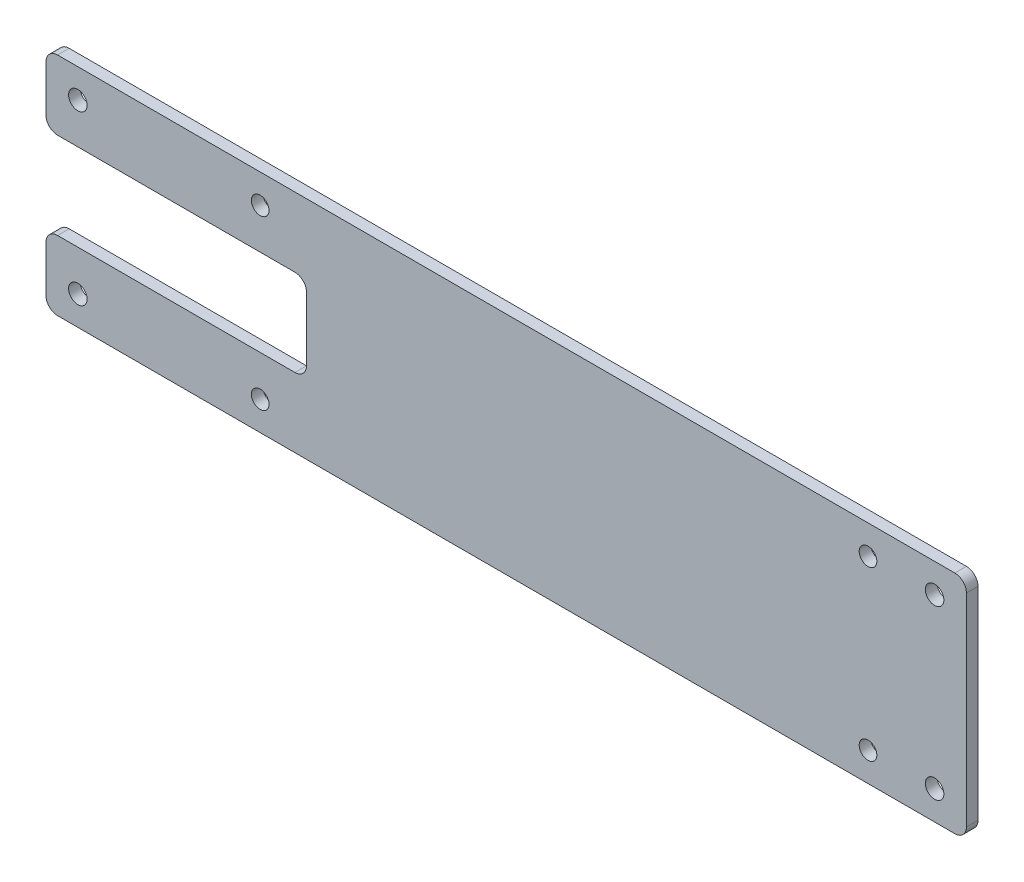
ISO-10303-21;
HEADER;
FILE_DESCRIPTION(('STEP AP214'),'2;1');
FILE_NAME('part.step','',(''),(''),'','','');
FILE_SCHEMA(('AUTOMOTIVE_DESIGN { 1 0 10303 214 1 1 1 1 }'));
ENDSEC;
DATA;
#1=APPLICATION_CONTEXT('core data for automotive mechanical design processes');
#2=APPLICATION_PROTOCOL_DEFINITION('international standard','automotive_design',2000,#1);
#3=PRODUCT_CONTEXT('',#1,'mechanical');
#4=PRODUCT('Part','Part','',(#3));
#5=PRODUCT_RELATED_PRODUCT_CATEGORY('part','',(#4));
#6=PRODUCT_DEFINITION_FORMATION('','',#4);
#7=PRODUCT_DEFINITION_CONTEXT('part definition',#1,'design');
#8=PRODUCT_DEFINITION('design','',#6,#7);
#9=PRODUCT_DEFINITION_SHAPE('','',#8);
#10=(LENGTH_UNIT() NAMED_UNIT(*) SI_UNIT(.MILLI.,.METRE.));
#11=(NAMED_UNIT(*) PLANE_ANGLE_UNIT() SI_UNIT($,.RADIAN.));
#12=(NAMED_UNIT(*) SI_UNIT($,.STERADIAN.) SOLID_ANGLE_UNIT());
#13=UNCERTAINTY_MEASURE_WITH_UNIT(LENGTH_MEASURE(1.E-05),#10,'distance_accuracy_value','');
#14=(GEOMETRIC_REPRESENTATION_CONTEXT(3) GLOBAL_UNCERTAINTY_ASSIGNED_CONTEXT((#13)) GLOBAL_UNIT_ASSIGNED_CONTEXT((#10,
#11,#12)) REPRESENTATION_CONTEXT('',''));
#15=CARTESIAN_POINT('',(0.,0.,0.));
#16=DIRECTION('',(0.,0.,1.));
#17=DIRECTION('',(1.,0.,0.));
#18=AXIS2_PLACEMENT_3D('',#15,#16,#17);
#19=CARTESIAN_POINT('',(-89.5,0.,2.));
#20=DIRECTION('',(-1.,0.,0.));
#21=DIRECTION('',(0.,0.,1.));
#22=AXIS2_PLACEMENT_3D('',#19,#20,#21);
#23=PLANE('',#22);
#24=DIRECTION('',(0.,1.,0.));
#25=VECTOR('',#24,1.);
#26=CARTESIAN_POINT('',(-89.5,0.,2.));
#27=LINE('',#26,#25);
#28=CARTESIAN_POINT('',(-89.5,-17.5,2.));
#29=VERTEX_POINT('',#28);
#30=CARTESIAN_POINT('',(-89.5,-9.5,2.));
#31=VERTEX_POINT('',#30);
#32=EDGE_CURVE('E305',#29,#31,#27,.T.);
#33=ORIENTED_EDGE('',*,*,#32,.T.);
#34=DIRECTION('',(0.,0.,1.));
#35=VECTOR('',#34,1.);
#36=CARTESIAN_POINT('',(-89.5,-9.5,2.));
#37=LINE('',#36,#35);
#38=CARTESIAN_POINT('',(-89.5,-9.5,0.));
#39=VERTEX_POINT('',#38);
#40=EDGE_CURVE('E219',#31,#39,#37,.F.);
#41=ORIENTED_EDGE('',*,*,#40,.T.);
#42=DIRECTION('',(0.,1.,0.));
#43=VECTOR('',#42,1.);
#44=CARTESIAN_POINT('',(-89.5,0.,0.));
#45=LINE('',#44,#43);
#46=CARTESIAN_POINT('',(-89.5,-17.5,0.));
#47=VERTEX_POINT('',#46);
#48=EDGE_CURVE('E268',#47,#39,#45,.T.);
#49=ORIENTED_EDGE('',*,*,#48,.F.);
#50=DIRECTION('',(0.,0.,-1.));
#51=VECTOR('',#50,1.);
#52=CARTESIAN_POINT('',(-89.5,-17.5,2.));
#53=LINE('',#52,#51);
#54=EDGE_CURVE('E221',#47,#29,#53,.F.);
#55=ORIENTED_EDGE('',*,*,#54,.T.);
#56=EDGE_LOOP('',(#33,#41,#49,#55));
#57=FACE_BOUND('',#56,.T.);
#58=ADVANCED_FACE('F38',(#57),#23,.T.);
#59=CARTESIAN_POINT('',(0.,0.,2.));
#60=DIRECTION('',(0.,0.,1.));
#61=DIRECTION('',(1.,0.,0.));
#62=AXIS2_PLACEMENT_3D('',#59,#60,#61);
#63=PLANE('',#62);
#64=CARTESIAN_POINT('',(-84.,-14.5,2.));
#65=DIRECTION('',(0.,0.,1.));
#66=DIRECTION('',(1.,0.,0.));
#67=AXIS2_PLACEMENT_3D('',#64,#65,#66);
#68=CIRCLE('',#67,1.6);
#69=CARTESIAN_POINT('',(-82.4,-14.5,2.));
#70=VERTEX_POINT('',#69);
#71=EDGE_CURVE('E244',#70,#70,#68,.T.);
#72=ORIENTED_EDGE('',*,*,#71,.F.);
#73=EDGE_LOOP('',(#72));
#74=FACE_BOUND('',#73,.T.);
#75=CARTESIAN_POINT('',(-84.,14.5,2.));
#76=DIRECTION('',(0.,0.,1.));
#77=DIRECTION('',(1.,0.,0.));
#78=AXIS2_PLACEMENT_3D('',#75,#76,#77);
#79=CIRCLE('',#78,1.6);
#80=CARTESIAN_POINT('',(-82.4,14.5,2.));
#81=VERTEX_POINT('',#80);
#82=EDGE_CURVE('E309',#81,#81,#79,.T.);
#83=ORIENTED_EDGE('',*,*,#82,.F.);
#84=EDGE_LOOP('',(#83));
#85=FACE_BOUND('',#84,.T.);
#86=CARTESIAN_POINT('',(52.5,14.5,2.));
#87=DIRECTION('',(0.,0.,1.));
#88=DIRECTION('',(1.,0.,0.));
#89=AXIS2_PLACEMENT_3D('',#86,#87,#88);
#90=CIRCLE('',#89,1.525);
#91=CARTESIAN_POINT('',(54.025,14.5,2.));
#92=VERTEX_POINT('',#91);
#93=EDGE_CURVE('E293',#92,#92,#90,.T.);
#94=ORIENTED_EDGE('',*,*,#93,.F.);
#95=EDGE_LOOP('',(#94));
#96=FACE_BOUND('',#95,.T.);
#97=CARTESIAN_POINT('',(52.5,-14.5,2.));
#98=DIRECTION('',(0.,0.,1.));
#99=DIRECTION('',(1.,0.,0.));
#100=AXIS2_PLACEMENT_3D('',#97,#98,#99);
#101=CIRCLE('',#100,1.525);
#102=CARTESIAN_POINT('',(54.025,-14.5,2.));
#103=VERTEX_POINT('',#102);
#104=EDGE_CURVE('E290',#103,#103,#101,.T.);
#105=ORIENTED_EDGE('',*,*,#104,.F.);
#106=EDGE_LOOP('',(#105));
#107=FACE_BOUND('',#106,.T.);
#108=CARTESIAN_POINT('',(-52.5,-14.5,2.));
#109=DIRECTION('',(0.,0.,1.));
#110=DIRECTION('',(1.,0.,0.));
#111=AXIS2_PLACEMENT_3D('',#108,#109,#110);
#112=CIRCLE('',#111,1.525);
#113=CARTESIAN_POINT('',(-50.975,-14.5,2.));
#114=VERTEX_POINT('',#113);
#115=EDGE_CURVE('E287',#114,#114,#112,.T.);
#116=ORIENTED_EDGE('',*,*,#115,.F.);
#117=EDGE_LOOP('',(#116));
#118=FACE_BOUND('',#117,.T.);
#119=CARTESIAN_POINT('',(-52.5,14.5,2.));
#120=DIRECTION('',(0.,0.,1.));
#121=DIRECTION('',(1.,0.,0.));
#122=AXIS2_PLACEMENT_3D('',#119,#120,#121);
#123=CIRCLE('',#122,1.525);
#124=CARTESIAN_POINT('',(-50.975,14.5,2.));
#125=VERTEX_POINT('',#124);
#126=EDGE_CURVE('E284',#125,#125,#123,.T.);
#127=ORIENTED_EDGE('',*,*,#126,.F.);
#128=EDGE_LOOP('',(#127));
#129=FACE_BOUND('',#128,.T.);
#130=CARTESIAN_POINT('',(64.,-14.5,2.));
#131=DIRECTION('',(0.,0.,1.));
#132=DIRECTION('',(1.,0.,0.));
#133=AXIS2_PLACEMENT_3D('',#130,#131,#132);
#134=CIRCLE('',#133,1.6);
#135=CARTESIAN_POINT('',(65.6,-14.5,2.));
#136=VERTEX_POINT('',#135);
#137=EDGE_CURVE('E281',#136,#136,#134,.T.);
#138=ORIENTED_EDGE('',*,*,#137,.F.);
#139=EDGE_LOOP('',(#138));
#140=FACE_BOUND('',#139,.T.);
#141=CARTESIAN_POINT('',(64.,14.5,2.));
#142=DIRECTION('',(0.,0.,1.));
#143=DIRECTION('',(1.,0.,0.));
#144=AXIS2_PLACEMENT_3D('',#141,#142,#143);
#145=CIRCLE('',#144,1.6);
#146=CARTESIAN_POINT('',(65.6,14.5,2.));
#147=VERTEX_POINT('',#146);
#148=EDGE_CURVE('E240',#147,#147,#145,.T.);
#149=ORIENTED_EDGE('',*,*,#148,.F.);
#150=EDGE_LOOP('',(#149));
#151=FACE_BOUND('',#150,.T.);
#152=DIRECTION('',(-1.,0.,0.));
#153=VECTOR('',#152,1.);
#154=CARTESIAN_POINT('',(0.,-7.49999999999999,2.));
#155=LINE('',#154,#153);
#156=CARTESIAN_POINT('',(-46.5,-7.5,2.));
#157=VERTEX_POINT('',#156);
#158=CARTESIAN_POINT('',(-87.5,-7.5,2.));
#159=VERTEX_POINT('',#158);
#160=EDGE_CURVE('E160',#157,#159,#155,.T.);
#161=ORIENTED_EDGE('',*,*,#160,.T.);
#162=CARTESIAN_POINT('',(-87.5,-9.5,2.));
#163=DIRECTION('',(0.,0.,1.));
#164=DIRECTION('',(1.,0.,0.));
#165=AXIS2_PLACEMENT_3D('',#162,#163,#164);
#166=CIRCLE('',#165,2.);
#167=EDGE_CURVE('E223',#159,#31,#166,.T.);
#168=ORIENTED_EDGE('',*,*,#167,.T.);
#169=ORIENTED_EDGE('',*,*,#32,.F.);
#170=CARTESIAN_POINT('',(-87.5,-17.5,2.));
#171=DIRECTION('',(0.,0.,1.));
#172=DIRECTION('',(1.,0.,0.));
#173=AXIS2_PLACEMENT_3D('',#170,#171,#172);
#174=CIRCLE('',#173,2.);
#175=CARTESIAN_POINT('',(-87.5,-19.5,2.));
#176=VERTEX_POINT('',#175);
#177=EDGE_CURVE('E225',#29,#176,#174,.T.);
#178=ORIENTED_EDGE('',*,*,#177,.T.);
#179=DIRECTION('',(-1.,0.,0.));
#180=VECTOR('',#179,1.);
#181=CARTESIAN_POINT('',(0.,-19.5,2.));
#182=LINE('',#181,#180);
#183=CARTESIAN_POINT('',(67.5,-19.5,2.));
#184=VERTEX_POINT('',#183);
#185=EDGE_CURVE('E302',#184,#176,#182,.T.);
#186=ORIENTED_EDGE('',*,*,#185,.F.);
#187=CARTESIAN_POINT('',(67.5,-17.5,2.));
#188=DIRECTION('',(0.,0.,1.));
#189=DIRECTION('',(1.,0.,0.));
#190=AXIS2_PLACEMENT_3D('',#187,#188,#189);
#191=CIRCLE('',#190,2.);
#192=CARTESIAN_POINT('',(69.5,-17.5,2.));
#193=VERTEX_POINT('',#192);
#194=EDGE_CURVE('E227',#184,#193,#191,.T.);
#195=ORIENTED_EDGE('',*,*,#194,.T.);
#196=DIRECTION('',(0.,1.,0.));
#197=VECTOR('',#196,1.);
#198=CARTESIAN_POINT('',(69.5,0.,2.));
#199=LINE('',#198,#197);
#200=CARTESIAN_POINT('',(69.5,17.5,2.));
#201=VERTEX_POINT('',#200);
#202=EDGE_CURVE('E299',#193,#201,#199,.T.);
#203=ORIENTED_EDGE('',*,*,#202,.T.);
#204=CARTESIAN_POINT('',(67.5,17.5,2.));
#205=DIRECTION('',(0.,0.,1.));
#206=DIRECTION('',(1.,0.,0.));
#207=AXIS2_PLACEMENT_3D('',#204,#205,#206);
#208=CIRCLE('',#207,2.);
#209=CARTESIAN_POINT('',(67.5,19.5,2.));
#210=VERTEX_POINT('',#209);
#211=EDGE_CURVE('E229',#201,#210,#208,.T.);
#212=ORIENTED_EDGE('',*,*,#211,.T.);
#213=DIRECTION('',(-1.,0.,0.));
#214=VECTOR('',#213,1.);
#215=CARTESIAN_POINT('',(0.,19.5,2.));
#216=LINE('',#215,#214);
#217=CARTESIAN_POINT('',(-87.5,19.5,2.));
#218=VERTEX_POINT('',#217);
#219=EDGE_CURVE('E296',#210,#218,#216,.T.);
#220=ORIENTED_EDGE('',*,*,#219,.T.);
#221=CARTESIAN_POINT('',(-87.5,17.5,2.));
#222=DIRECTION('',(0.,0.,1.));
#223=DIRECTION('',(1.,0.,0.));
#224=AXIS2_PLACEMENT_3D('',#221,#222,#223);
#225=CIRCLE('',#224,2.);
#226=CARTESIAN_POINT('',(-89.5,17.5,2.));
#227=VERTEX_POINT('',#226);
#228=EDGE_CURVE('E231',#218,#227,#225,.T.);
#229=ORIENTED_EDGE('',*,*,#228,.T.);
#230=CARTESIAN_POINT('',(-89.5,9.5,2.));
#231=VERTEX_POINT('',#230);
#232=EDGE_CURVE('E306',#231,#227,#27,.T.);
#233=ORIENTED_EDGE('',*,*,#232,.F.);
#234=CARTESIAN_POINT('',(-87.5,9.5,2.));
#235=DIRECTION('',(0.,0.,1.));
#236=DIRECTION('',(1.,0.,0.));
#237=AXIS2_PLACEMENT_3D('',#234,#235,#236);
#238=CIRCLE('',#237,2.);
#239=CARTESIAN_POINT('',(-87.5,7.5,2.));
#240=VERTEX_POINT('',#239);
#241=EDGE_CURVE('E233',#231,#240,#238,.T.);
#242=ORIENTED_EDGE('',*,*,#241,.T.);
#243=DIRECTION('',(-1.,0.,0.));
#244=VECTOR('',#243,1.);
#245=CARTESIAN_POINT('',(0.,7.50000000000001,2.));
#246=LINE('',#245,#244);
#247=CARTESIAN_POINT('',(-46.5,7.5,2.));
#248=VERTEX_POINT('',#247);
#249=EDGE_CURVE('E278',#248,#240,#246,.T.);
#250=ORIENTED_EDGE('',*,*,#249,.F.);
#251=CARTESIAN_POINT('',(-46.5,5.5,2.));
#252=DIRECTION('',(0.,0.,1.));
#253=DIRECTION('',(1.,0.,0.));
#254=AXIS2_PLACEMENT_3D('',#251,#252,#253);
#255=CIRCLE('',#254,2.);
#256=CARTESIAN_POINT('',(-44.5,5.5,2.));
#257=VERTEX_POINT('',#256);
#258=EDGE_CURVE('E46',#248,#257,#255,.F.);
#259=ORIENTED_EDGE('',*,*,#258,.T.);
#260=DIRECTION('',(0.,1.,0.));
#261=VECTOR('',#260,1.);
#262=CARTESIAN_POINT('',(-44.5,0.,2.));
#263=LINE('',#262,#261);
#264=CARTESIAN_POINT('',(-44.5,-5.5,2.));
#265=VERTEX_POINT('',#264);
#266=EDGE_CURVE('E316',#265,#257,#263,.T.);
#267=ORIENTED_EDGE('',*,*,#266,.F.);
#268=CARTESIAN_POINT('',(-46.5,-5.5,2.));
#269=DIRECTION('',(0.,0.,1.));
#270=DIRECTION('',(1.,0.,0.));
#271=AXIS2_PLACEMENT_3D('',#268,#269,#270);
#272=CIRCLE('',#271,2.);
#273=EDGE_CURVE('E178',#265,#157,#272,.F.);
#274=ORIENTED_EDGE('',*,*,#273,.T.);
#275=EDGE_LOOP('',(#161,#168,#169,#178,#186,#195,#203,#212,#220,#229,#233,#242,#250,#259,#267,#274));
#276=FACE_BOUND('',#275,.T.);
#277=ADVANCED_FACE('F320',(#74,#85,#96,#107,#118,#129,#140,#151,#276),#63,.T.);
#278=CARTESIAN_POINT('',(0.,0.,0.));
#279=DIRECTION('',(0.,0.,1.));
#280=DIRECTION('',(1.,0.,0.));
#281=AXIS2_PLACEMENT_3D('',#278,#279,#280);
#282=PLANE('',#281);
#283=CARTESIAN_POINT('',(64.,14.5,0.));
#284=DIRECTION('',(0.,0.,1.));
#285=DIRECTION('',(1.,0.,0.));
#286=AXIS2_PLACEMENT_3D('',#283,#284,#285);
#287=CIRCLE('',#286,1.6);
#288=CARTESIAN_POINT('',(65.6,14.5,0.));
#289=VERTEX_POINT('',#288);
#290=EDGE_CURVE('E241',#289,#289,#287,.T.);
#291=ORIENTED_EDGE('',*,*,#290,.T.);
#292=EDGE_LOOP('',(#291));
#293=FACE_BOUND('',#292,.T.);
#294=CARTESIAN_POINT('',(64.,-14.5,0.));
#295=DIRECTION('',(0.,0.,1.));
#296=DIRECTION('',(1.,0.,0.));
#297=AXIS2_PLACEMENT_3D('',#294,#295,#296);
#298=CIRCLE('',#297,1.6);
#299=CARTESIAN_POINT('',(65.6,-14.5,0.));
#300=VERTEX_POINT('',#299);
#301=EDGE_CURVE('E245',#300,#300,#298,.T.);
#302=ORIENTED_EDGE('',*,*,#301,.T.);
#303=EDGE_LOOP('',(#302));
#304=FACE_BOUND('',#303,.T.);
#305=CARTESIAN_POINT('',(-52.5,14.5,0.));
#306=DIRECTION('',(0.,0.,1.));
#307=DIRECTION('',(1.,0.,0.));
#308=AXIS2_PLACEMENT_3D('',#305,#306,#307);
#309=CIRCLE('',#308,1.525);
#310=CARTESIAN_POINT('',(-50.975,14.5,0.));
#311=VERTEX_POINT('',#310);
#312=EDGE_CURVE('E248',#311,#311,#309,.T.);
#313=ORIENTED_EDGE('',*,*,#312,.T.);
#314=EDGE_LOOP('',(#313));
#315=FACE_BOUND('',#314,.T.);
#316=CARTESIAN_POINT('',(-52.5,-14.5,0.));
#317=DIRECTION('',(0.,0.,1.));
#318=DIRECTION('',(1.,0.,0.));
#319=AXIS2_PLACEMENT_3D('',#316,#317,#318);
#320=CIRCLE('',#319,1.525);
#321=CARTESIAN_POINT('',(-50.975,-14.5,0.));
#322=VERTEX_POINT('',#321);
#323=EDGE_CURVE('E251',#322,#322,#320,.T.);
#324=ORIENTED_EDGE('',*,*,#323,.T.);
#325=EDGE_LOOP('',(#324));
#326=FACE_BOUND('',#325,.T.);
#327=CARTESIAN_POINT('',(52.5,-14.5,0.));
#328=DIRECTION('',(0.,0.,1.));
#329=DIRECTION('',(1.,0.,0.));
#330=AXIS2_PLACEMENT_3D('',#327,#328,#329);
#331=CIRCLE('',#330,1.525);
#332=CARTESIAN_POINT('',(54.025,-14.5,0.));
#333=VERTEX_POINT('',#332);
#334=EDGE_CURVE('E254',#333,#333,#331,.T.);
#335=ORIENTED_EDGE('',*,*,#334,.T.);
#336=EDGE_LOOP('',(#335));
#337=FACE_BOUND('',#336,.T.);
#338=CARTESIAN_POINT('',(52.5,14.5,0.));
#339=DIRECTION('',(0.,0.,1.));
#340=DIRECTION('',(1.,0.,0.));
#341=AXIS2_PLACEMENT_3D('',#338,#339,#340);
#342=CIRCLE('',#341,1.525);
#343=CARTESIAN_POINT('',(54.025,14.5,0.));
#344=VERTEX_POINT('',#343);
#345=EDGE_CURVE('E257',#344,#344,#342,.T.);
#346=ORIENTED_EDGE('',*,*,#345,.T.);
#347=EDGE_LOOP('',(#346));
#348=FACE_BOUND('',#347,.T.);
#349=CARTESIAN_POINT('',(-84.,14.5,0.));
#350=DIRECTION('',(0.,0.,1.));
#351=DIRECTION('',(1.,0.,0.));
#352=AXIS2_PLACEMENT_3D('',#349,#350,#351);
#353=CIRCLE('',#352,1.6);
#354=CARTESIAN_POINT('',(-82.4,14.5,0.));
#355=VERTEX_POINT('',#354);
#356=EDGE_CURVE('E272',#355,#355,#353,.T.);
#357=ORIENTED_EDGE('',*,*,#356,.T.);
#358=EDGE_LOOP('',(#357));
#359=FACE_BOUND('',#358,.T.);
#360=CARTESIAN_POINT('',(-84.,-14.5,0.));
#361=DIRECTION('',(0.,0.,1.));
#362=DIRECTION('',(1.,0.,0.));
#363=AXIS2_PLACEMENT_3D('',#360,#361,#362);
#364=CIRCLE('',#363,1.6);
#365=CARTESIAN_POINT('',(-82.4,-14.5,0.));
#366=VERTEX_POINT('',#365);
#367=EDGE_CURVE('E275',#366,#366,#364,.T.);
#368=ORIENTED_EDGE('',*,*,#367,.T.);
#369=EDGE_LOOP('',(#368));
#370=FACE_BOUND('',#369,.T.);
#371=ORIENTED_EDGE('',*,*,#48,.T.);
#372=CARTESIAN_POINT('',(-87.5,-9.5,0.));
#373=DIRECTION('',(0.,0.,1.));
#374=DIRECTION('',(1.,0.,0.));
#375=AXIS2_PLACEMENT_3D('',#372,#373,#374);
#376=CIRCLE('',#375,2.);
#377=CARTESIAN_POINT('',(-87.5,-7.5,0.));
#378=VERTEX_POINT('',#377);
#379=EDGE_CURVE('E171',#39,#378,#376,.F.);
#380=ORIENTED_EDGE('',*,*,#379,.T.);
#381=DIRECTION('',(-1.,0.,0.));
#382=VECTOR('',#381,1.);
#383=CARTESIAN_POINT('',(0.,-7.49999999999999,0.));
#384=LINE('',#383,#382);
#385=CARTESIAN_POINT('',(-46.5,-7.5,0.));
#386=VERTEX_POINT('',#385);
#387=EDGE_CURVE('E157',#386,#378,#384,.T.);
#388=ORIENTED_EDGE('',*,*,#387,.F.);
#389=CARTESIAN_POINT('',(-46.5,-5.5,0.));
#390=DIRECTION('',(0.,0.,1.));
#391=DIRECTION('',(1.,0.,0.));
#392=AXIS2_PLACEMENT_3D('',#389,#390,#391);
#393=CIRCLE('',#392,2.);
#394=CARTESIAN_POINT('',(-44.5,-5.5,0.));
#395=VERTEX_POINT('',#394);
#396=EDGE_CURVE('E168',#386,#395,#393,.T.);
#397=ORIENTED_EDGE('',*,*,#396,.T.);
#398=DIRECTION('',(0.,1.,0.));
#399=VECTOR('',#398,1.);
#400=CARTESIAN_POINT('',(-44.5,0.,0.));
#401=LINE('',#400,#399);
#402=CARTESIAN_POINT('',(-44.5,5.5,0.));
#403=VERTEX_POINT('',#402);
#404=EDGE_CURVE('E238',#395,#403,#401,.T.);
#405=ORIENTED_EDGE('',*,*,#404,.T.);
#406=CARTESIAN_POINT('',(-46.5,5.5,0.));
#407=DIRECTION('',(0.,0.,1.));
#408=DIRECTION('',(1.,0.,0.));
#409=AXIS2_PLACEMENT_3D('',#406,#407,#408);
#410=CIRCLE('',#409,2.);
#411=CARTESIAN_POINT('',(-46.5,7.5,0.));
#412=VERTEX_POINT('',#411);
#413=EDGE_CURVE('E11',#403,#412,#410,.T.);
#414=ORIENTED_EDGE('',*,*,#413,.T.);
#415=DIRECTION('',(-1.,0.,0.));
#416=VECTOR('',#415,1.);
#417=CARTESIAN_POINT('',(0.,7.50000000000001,0.));
#418=LINE('',#417,#416);
#419=CARTESIAN_POINT('',(-87.5,7.5,0.));
#420=VERTEX_POINT('',#419);
#421=EDGE_CURVE('E172',#412,#420,#418,.T.);
#422=ORIENTED_EDGE('',*,*,#421,.T.);
#423=CARTESIAN_POINT('',(-87.5,9.5,0.));
#424=DIRECTION('',(0.,0.,1.));
#425=DIRECTION('',(1.,0.,0.));
#426=AXIS2_PLACEMENT_3D('',#423,#424,#425);
#427=CIRCLE('',#426,2.);
#428=CARTESIAN_POINT('',(-89.5,9.5,0.));
#429=VERTEX_POINT('',#428);
#430=EDGE_CURVE('E217',#420,#429,#427,.F.);
#431=ORIENTED_EDGE('',*,*,#430,.T.);
#432=CARTESIAN_POINT('',(-89.5,17.5,0.));
#433=VERTEX_POINT('',#432);
#434=EDGE_CURVE('E269',#429,#433,#45,.T.);
#435=ORIENTED_EDGE('',*,*,#434,.T.);
#436=CARTESIAN_POINT('',(-87.5,17.5,0.));
#437=DIRECTION('',(0.,0.,1.));
#438=DIRECTION('',(1.,0.,0.));
#439=AXIS2_PLACEMENT_3D('',#436,#437,#438);
#440=CIRCLE('',#439,2.);
#441=CARTESIAN_POINT('',(-87.5,19.5,0.));
#442=VERTEX_POINT('',#441);
#443=EDGE_CURVE('E215',#433,#442,#440,.F.);
#444=ORIENTED_EDGE('',*,*,#443,.T.);
#445=DIRECTION('',(-1.,0.,0.));
#446=VECTOR('',#445,1.);
#447=CARTESIAN_POINT('',(0.,19.5,0.));
#448=LINE('',#447,#446);
#449=CARTESIAN_POINT('',(67.5,19.5,0.));
#450=VERTEX_POINT('',#449);
#451=EDGE_CURVE('E260',#450,#442,#448,.T.);
#452=ORIENTED_EDGE('',*,*,#451,.F.);
#453=CARTESIAN_POINT('',(67.5,17.5,0.));
#454=DIRECTION('',(0.,0.,1.));
#455=DIRECTION('',(1.,0.,0.));
#456=AXIS2_PLACEMENT_3D('',#453,#454,#455);
#457=CIRCLE('',#456,2.);
#458=CARTESIAN_POINT('',(69.5,17.5,0.));
#459=VERTEX_POINT('',#458);
#460=EDGE_CURVE('E213',#450,#459,#457,.F.);
#461=ORIENTED_EDGE('',*,*,#460,.T.);
#462=DIRECTION('',(0.,1.,0.));
#463=VECTOR('',#462,1.);
#464=CARTESIAN_POINT('',(69.5,0.,0.));
#465=LINE('',#464,#463);
#466=CARTESIAN_POINT('',(69.5,-17.5,0.));
#467=VERTEX_POINT('',#466);
#468=EDGE_CURVE('E263',#467,#459,#465,.T.);
#469=ORIENTED_EDGE('',*,*,#468,.F.);
#470=CARTESIAN_POINT('',(67.5,-17.5,0.));
#471=DIRECTION('',(0.,0.,1.));
#472=DIRECTION('',(1.,0.,0.));
#473=AXIS2_PLACEMENT_3D('',#470,#471,#472);
#474=CIRCLE('',#473,2.);
#475=CARTESIAN_POINT('',(67.5,-19.5,0.));
#476=VERTEX_POINT('',#475);
#477=EDGE_CURVE('E61',#467,#476,#474,.F.);
#478=ORIENTED_EDGE('',*,*,#477,.T.);
#479=DIRECTION('',(-1.,0.,0.));
#480=VECTOR('',#479,1.);
#481=CARTESIAN_POINT('',(0.,-19.5,0.));
#482=LINE('',#481,#480);
#483=CARTESIAN_POINT('',(-87.5,-19.5,0.));
#484=VERTEX_POINT('',#483);
#485=EDGE_CURVE('E266',#476,#484,#482,.T.);
#486=ORIENTED_EDGE('',*,*,#485,.T.);
#487=CARTESIAN_POINT('',(-87.5,-17.5,0.));
#488=DIRECTION('',(0.,0.,1.));
#489=DIRECTION('',(1.,0.,0.));
#490=AXIS2_PLACEMENT_3D('',#487,#488,#489);
#491=CIRCLE('',#490,2.);
#492=EDGE_CURVE('E53',#484,#47,#491,.F.);
#493=ORIENTED_EDGE('',*,*,#492,.T.);
#494=EDGE_LOOP('',(#371,#380,#388,#397,#405,#414,#422,#431,#435,#444,#452,#461,#469,#478,#486,#493));
#495=FACE_BOUND('',#494,.T.);
#496=ADVANCED_FACE('F166',(#293,#304,#315,#326,#337,#348,#359,#370,#495),#282,.F.);
#497=ORIENTED_EDGE('',*,*,#232,.T.);
#498=DIRECTION('',(0.,0.,-1.));
#499=VECTOR('',#498,1.);
#500=CARTESIAN_POINT('',(-89.5,17.5,0.));
#501=LINE('',#500,#499);
#502=EDGE_CURVE('E190',#227,#433,#501,.T.);
#503=ORIENTED_EDGE('',*,*,#502,.T.);
#504=ORIENTED_EDGE('',*,*,#434,.F.);
#505=DIRECTION('',(0.,0.,1.));
#506=VECTOR('',#505,1.);
#507=CARTESIAN_POINT('',(-89.5,9.5,2.));
#508=LINE('',#507,#506);
#509=EDGE_CURVE('E193',#429,#231,#508,.T.);
#510=ORIENTED_EDGE('',*,*,#509,.T.);
#511=EDGE_LOOP('',(#497,#503,#504,#510));
#512=FACE_BOUND('',#511,.T.);
#513=ADVANCED_FACE('F342',(#512),#23,.T.);
#514=CARTESIAN_POINT('',(0.,-19.5,2.));
#515=DIRECTION('',(0.,-1.,0.));
#516=DIRECTION('',(0.,0.,-1.));
#517=AXIS2_PLACEMENT_3D('',#514,#515,#516);
#518=PLANE('',#517);
#519=ORIENTED_EDGE('',*,*,#185,.T.);
#520=DIRECTION('',(0.,0.,-1.));
#521=VECTOR('',#520,1.);
#522=CARTESIAN_POINT('',(-87.5,-19.5,2.));
#523=LINE('',#522,#521);
#524=EDGE_CURVE('E206',#176,#484,#523,.T.);
#525=ORIENTED_EDGE('',*,*,#524,.T.);
#526=ORIENTED_EDGE('',*,*,#485,.F.);
#527=DIRECTION('',(0.,0.,-1.));
#528=VECTOR('',#527,1.);
#529=CARTESIAN_POINT('',(67.5,-19.5,2.));
#530=LINE('',#529,#528);
#531=EDGE_CURVE('E208',#476,#184,#530,.F.);
#532=ORIENTED_EDGE('',*,*,#531,.T.);
#533=EDGE_LOOP('',(#519,#525,#526,#532));
#534=FACE_BOUND('',#533,.T.);
#535=ADVANCED_FACE('F367',(#534),#518,.T.);
#536=CARTESIAN_POINT('',(69.5,0.,2.));
#537=DIRECTION('',(-1.,0.,0.));
#538=DIRECTION('',(0.,0.,1.));
#539=AXIS2_PLACEMENT_3D('',#536,#537,#538);
#540=PLANE('',#539);
#541=ORIENTED_EDGE('',*,*,#202,.F.);
#542=DIRECTION('',(0.,0.,-1.));
#543=VECTOR('',#542,1.);
#544=CARTESIAN_POINT('',(69.5,-17.5,0.));
#545=LINE('',#544,#543);
#546=EDGE_CURVE('E201',#193,#467,#545,.T.);
#547=ORIENTED_EDGE('',*,*,#546,.T.);
#548=ORIENTED_EDGE('',*,*,#468,.T.);
#549=DIRECTION('',(0.,0.,-1.));
#550=VECTOR('',#549,1.);
#551=CARTESIAN_POINT('',(69.5,17.5,2.));
#552=LINE('',#551,#550);
#553=EDGE_CURVE('E204',#459,#201,#552,.F.);
#554=ORIENTED_EDGE('',*,*,#553,.T.);
#555=EDGE_LOOP('',(#541,#547,#548,#554));
#556=FACE_BOUND('',#555,.T.);
#557=ADVANCED_FACE('F359',(#556),#540,.F.);
#558=CARTESIAN_POINT('',(64.,-14.5,2.));
#559=DIRECTION('',(0.,0.,-1.));
#560=DIRECTION('',(-1.,0.,0.));
#561=AXIS2_PLACEMENT_3D('',#558,#559,#560);
#562=CYLINDRICAL_SURFACE('',#561,1.6);
#563=ORIENTED_EDGE('',*,*,#137,.T.);
#564=EDGE_LOOP('',(#563));
#565=FACE_BOUND('',#564,.T.);
#566=ORIENTED_EDGE('',*,*,#301,.F.);
#567=EDGE_LOOP('',(#566));
#568=FACE_BOUND('',#567,.T.);
#569=ADVANCED_FACE('F410',(#565,#568),#562,.F.);
#570=CARTESIAN_POINT('',(-52.5,14.5,2.));
#571=DIRECTION('',(0.,0.,-1.));
#572=DIRECTION('',(-1.,0.,0.));
#573=AXIS2_PLACEMENT_3D('',#570,#571,#572);
#574=CYLINDRICAL_SURFACE('',#573,1.525);
#575=ORIENTED_EDGE('',*,*,#126,.T.);
#576=EDGE_LOOP('',(#575));
#577=FACE_BOUND('',#576,.T.);
#578=ORIENTED_EDGE('',*,*,#312,.F.);
#579=EDGE_LOOP('',(#578));
#580=FACE_BOUND('',#579,.T.);
#581=ADVANCED_FACE('F413',(#577,#580),#574,.F.);
#582=CARTESIAN_POINT('',(-52.5,-14.5,2.));
#583=DIRECTION('',(0.,0.,-1.));
#584=DIRECTION('',(-1.,0.,0.));
#585=AXIS2_PLACEMENT_3D('',#582,#583,#584);
#586=CYLINDRICAL_SURFACE('',#585,1.525);
#587=ORIENTED_EDGE('',*,*,#115,.T.);
#588=EDGE_LOOP('',(#587));
#589=FACE_BOUND('',#588,.T.);
#590=ORIENTED_EDGE('',*,*,#323,.F.);
#591=EDGE_LOOP('',(#590));
#592=FACE_BOUND('',#591,.T.);
#593=ADVANCED_FACE('F417',(#589,#592),#586,.F.);
#594=CARTESIAN_POINT('',(52.5,-14.5,2.));
#595=DIRECTION('',(0.,0.,-1.));
#596=DIRECTION('',(-1.,0.,0.));
#597=AXIS2_PLACEMENT_3D('',#594,#595,#596);
#598=CYLINDRICAL_SURFACE('',#597,1.525);
#599=ORIENTED_EDGE('',*,*,#104,.T.);
#600=EDGE_LOOP('',(#599));
#601=FACE_BOUND('',#600,.T.);
#602=ORIENTED_EDGE('',*,*,#334,.F.);
#603=EDGE_LOOP('',(#602));
#604=FACE_BOUND('',#603,.T.);
#605=ADVANCED_FACE('F421',(#601,#604),#598,.F.);
#606=CARTESIAN_POINT('',(52.5,14.5,2.));
#607=DIRECTION('',(0.,0.,-1.));
#608=DIRECTION('',(-1.,0.,0.));
#609=AXIS2_PLACEMENT_3D('',#606,#607,#608);
#610=CYLINDRICAL_SURFACE('',#609,1.525);
#611=ORIENTED_EDGE('',*,*,#93,.T.);
#612=EDGE_LOOP('',(#611));
#613=FACE_BOUND('',#612,.T.);
#614=ORIENTED_EDGE('',*,*,#345,.F.);
#615=EDGE_LOOP('',(#614));
#616=FACE_BOUND('',#615,.T.);
#617=ADVANCED_FACE('F425',(#613,#616),#610,.F.);
#618=CARTESIAN_POINT('',(0.,19.5,2.));
#619=DIRECTION('',(0.,-1.,0.));
#620=DIRECTION('',(1.,0.,0.));
#621=AXIS2_PLACEMENT_3D('',#618,#619,#620);
#622=PLANE('',#621);
#623=ORIENTED_EDGE('',*,*,#219,.F.);
#624=DIRECTION('',(0.,0.,-1.));
#625=VECTOR('',#624,1.);
#626=CARTESIAN_POINT('',(67.5,19.5,2.));
#627=LINE('',#626,#625);
#628=EDGE_CURVE('E196',#210,#450,#627,.T.);
#629=ORIENTED_EDGE('',*,*,#628,.T.);
#630=ORIENTED_EDGE('',*,*,#451,.T.);
#631=DIRECTION('',(0.,0.,-1.));
#632=VECTOR('',#631,1.);
#633=CARTESIAN_POINT('',(-87.5,19.5,2.));
#634=LINE('',#633,#632);
#635=EDGE_CURVE('E199',#442,#218,#634,.F.);
#636=ORIENTED_EDGE('',*,*,#635,.T.);
#637=EDGE_LOOP('',(#623,#629,#630,#636));
#638=FACE_BOUND('',#637,.T.);
#639=ADVANCED_FACE('F349',(#638),#622,.F.);
#640=CARTESIAN_POINT('',(-84.,14.5,2.));
#641=DIRECTION('',(0.,0.,-1.));
#642=DIRECTION('',(-1.,0.,0.));
#643=AXIS2_PLACEMENT_3D('',#640,#641,#642);
#644=CYLINDRICAL_SURFACE('',#643,1.6);
#645=ORIENTED_EDGE('',*,*,#82,.T.);
#646=EDGE_LOOP('',(#645));
#647=FACE_BOUND('',#646,.T.);
#648=ORIENTED_EDGE('',*,*,#356,.F.);
#649=EDGE_LOOP('',(#648));
#650=FACE_BOUND('',#649,.T.);
#651=ADVANCED_FACE('F432',(#647,#650),#644,.F.);
#652=CARTESIAN_POINT('',(-84.,-14.5,2.));
#653=DIRECTION('',(0.,0.,-1.));
#654=DIRECTION('',(-1.,0.,0.));
#655=AXIS2_PLACEMENT_3D('',#652,#653,#654);
#656=CYLINDRICAL_SURFACE('',#655,1.6);
#657=ORIENTED_EDGE('',*,*,#71,.T.);
#658=EDGE_LOOP('',(#657));
#659=FACE_BOUND('',#658,.T.);
#660=ORIENTED_EDGE('',*,*,#367,.F.);
#661=EDGE_LOOP('',(#660));
#662=FACE_BOUND('',#661,.T.);
#663=ADVANCED_FACE('F408',(#659,#662),#656,.F.);
#664=CARTESIAN_POINT('',(64.,14.5,2.));
#665=DIRECTION('',(0.,0.,-1.));
#666=DIRECTION('',(-1.,0.,0.));
#667=AXIS2_PLACEMENT_3D('',#664,#665,#666);
#668=CYLINDRICAL_SURFACE('',#667,1.6);
#669=ORIENTED_EDGE('',*,*,#148,.T.);
#670=EDGE_LOOP('',(#669));
#671=FACE_BOUND('',#670,.T.);
#672=ORIENTED_EDGE('',*,*,#290,.F.);
#673=EDGE_LOOP('',(#672));
#674=FACE_BOUND('',#673,.T.);
#675=ADVANCED_FACE('F405',(#671,#674),#668,.F.);
#676=CARTESIAN_POINT('',(0.,-7.49999999999999,-8.));
#677=DIRECTION('',(0.,1.,0.));
#678=DIRECTION('',(-1.,0.,0.));
#679=AXIS2_PLACEMENT_3D('',#676,#677,#678);
#680=PLANE('',#679);
#681=ORIENTED_EDGE('',*,*,#387,.T.);
#682=DIRECTION('',(0.,0.,1.));
#683=VECTOR('',#682,1.);
#684=CARTESIAN_POINT('',(-87.5,-7.5,-8.));
#685=LINE('',#684,#683);
#686=EDGE_CURVE('E163',#378,#159,#685,.T.);
#687=ORIENTED_EDGE('',*,*,#686,.T.);
#688=ORIENTED_EDGE('',*,*,#160,.F.);
#689=DIRECTION('',(0.,0.,1.));
#690=VECTOR('',#689,1.);
#691=CARTESIAN_POINT('',(-46.5,-7.5,-8.));
#692=LINE('',#691,#690);
#693=EDGE_CURVE('E153',#157,#386,#692,.F.);
#694=ORIENTED_EDGE('',*,*,#693,.T.);
#695=EDGE_LOOP('',(#681,#687,#688,#694));
#696=FACE_BOUND('',#695,.T.);
#697=ADVANCED_FACE('F155',(#696),#680,.T.);
#698=CARTESIAN_POINT('',(0.,7.50000000000001,-8.));
#699=DIRECTION('',(0.,1.,0.));
#700=DIRECTION('',(-1.,0.,0.));
#701=AXIS2_PLACEMENT_3D('',#698,#699,#700);
#702=PLANE('',#701);
#703=ORIENTED_EDGE('',*,*,#249,.T.);
#704=DIRECTION('',(0.,0.,1.));
#705=VECTOR('',#704,1.);
#706=CARTESIAN_POINT('',(-87.5,7.5,0.));
#707=LINE('',#706,#705);
#708=EDGE_CURVE('E185',#240,#420,#707,.F.);
#709=ORIENTED_EDGE('',*,*,#708,.T.);
#710=ORIENTED_EDGE('',*,*,#421,.F.);
#711=DIRECTION('',(0.,0.,1.));
#712=VECTOR('',#711,1.);
#713=CARTESIAN_POINT('',(-46.5,7.5,2.));
#714=LINE('',#713,#712);
#715=EDGE_CURVE('E187',#412,#248,#714,.T.);
#716=ORIENTED_EDGE('',*,*,#715,.T.);
#717=EDGE_LOOP('',(#703,#709,#710,#716));
#718=FACE_BOUND('',#717,.T.);
#719=ADVANCED_FACE('F333',(#718),#702,.F.);
#720=CARTESIAN_POINT('',(-44.5,0.,-8.));
#721=DIRECTION('',(1.,0.,0.));
#722=DIRECTION('',(0.,0.,-1.));
#723=AXIS2_PLACEMENT_3D('',#720,#721,#722);
#724=PLANE('',#723);
#725=ORIENTED_EDGE('',*,*,#404,.F.);
#726=DIRECTION('',(0.,0.,1.));
#727=VECTOR('',#726,1.);
#728=CARTESIAN_POINT('',(-44.5,-5.5,-8.));
#729=LINE('',#728,#727);
#730=EDGE_CURVE('E177',#395,#265,#729,.T.);
#731=ORIENTED_EDGE('',*,*,#730,.T.);
#732=ORIENTED_EDGE('',*,*,#266,.T.);
#733=DIRECTION('',(0.,0.,1.));
#734=VECTOR('',#733,1.);
#735=CARTESIAN_POINT('',(-44.5,5.5,0.));
#736=LINE('',#735,#734);
#737=EDGE_CURVE('E183',#257,#403,#736,.F.);
#738=ORIENTED_EDGE('',*,*,#737,.T.);
#739=EDGE_LOOP('',(#725,#731,#732,#738));
#740=FACE_BOUND('',#739,.T.);
#741=ADVANCED_FACE('F325',(#740),#724,.F.);
#742=CARTESIAN_POINT('',(-87.5,-9.5,-8.));
#743=DIRECTION('',(0.,0.,1.));
#744=DIRECTION('',(1.,0.,0.));
#745=AXIS2_PLACEMENT_3D('',#742,#743,#744);
#746=CYLINDRICAL_SURFACE('',#745,2.);
#747=ORIENTED_EDGE('',*,*,#379,.F.);
#748=ORIENTED_EDGE('',*,*,#40,.F.);
#749=ORIENTED_EDGE('',*,*,#167,.F.);
#750=ORIENTED_EDGE('',*,*,#686,.F.);
#751=EDGE_LOOP('',(#747,#748,#749,#750));
#752=FACE_BOUND('',#751,.T.);
#753=ADVANCED_FACE('F374',(#752),#746,.T.);
#754=CARTESIAN_POINT('',(-87.5,-17.5,2.));
#755=DIRECTION('',(0.,0.,-1.));
#756=DIRECTION('',(-1.,0.,0.));
#757=AXIS2_PLACEMENT_3D('',#754,#755,#756);
#758=CYLINDRICAL_SURFACE('',#757,2.);
#759=ORIENTED_EDGE('',*,*,#177,.F.);
#760=ORIENTED_EDGE('',*,*,#54,.F.);
#761=ORIENTED_EDGE('',*,*,#492,.F.);
#762=ORIENTED_EDGE('',*,*,#524,.F.);
#763=EDGE_LOOP('',(#759,#760,#761,#762));
#764=FACE_BOUND('',#763,.T.);
#765=ADVANCED_FACE('F369',(#764),#758,.T.);
#766=CARTESIAN_POINT('',(67.5,-17.5,2.));
#767=DIRECTION('',(0.,0.,1.));
#768=DIRECTION('',(1.,0.,0.));
#769=AXIS2_PLACEMENT_3D('',#766,#767,#768);
#770=CYLINDRICAL_SURFACE('',#769,2.);
#771=ORIENTED_EDGE('',*,*,#194,.F.);
#772=ORIENTED_EDGE('',*,*,#531,.F.);
#773=ORIENTED_EDGE('',*,*,#477,.F.);
#774=ORIENTED_EDGE('',*,*,#546,.F.);
#775=EDGE_LOOP('',(#771,#772,#773,#774));
#776=FACE_BOUND('',#775,.T.);
#777=ADVANCED_FACE('F363',(#776),#770,.T.);
#778=CARTESIAN_POINT('',(67.5,17.5,2.));
#779=DIRECTION('',(0.,0.,-1.));
#780=DIRECTION('',(-1.,0.,0.));
#781=AXIS2_PLACEMENT_3D('',#778,#779,#780);
#782=CYLINDRICAL_SURFACE('',#781,2.);
#783=ORIENTED_EDGE('',*,*,#211,.F.);
#784=ORIENTED_EDGE('',*,*,#553,.F.);
#785=ORIENTED_EDGE('',*,*,#460,.F.);
#786=ORIENTED_EDGE('',*,*,#628,.F.);
#787=EDGE_LOOP('',(#783,#784,#785,#786));
#788=FACE_BOUND('',#787,.T.);
#789=ADVANCED_FACE('F355',(#788),#782,.T.);
#790=CARTESIAN_POINT('',(-87.5,17.5,2.));
#791=DIRECTION('',(0.,0.,1.));
#792=DIRECTION('',(1.,0.,0.));
#793=AXIS2_PLACEMENT_3D('',#790,#791,#792);
#794=CYLINDRICAL_SURFACE('',#793,2.);
#795=ORIENTED_EDGE('',*,*,#228,.F.);
#796=ORIENTED_EDGE('',*,*,#635,.F.);
#797=ORIENTED_EDGE('',*,*,#443,.F.);
#798=ORIENTED_EDGE('',*,*,#502,.F.);
#799=EDGE_LOOP('',(#795,#796,#797,#798));
#800=FACE_BOUND('',#799,.T.);
#801=ADVANCED_FACE('F352',(#800),#794,.T.);
#802=CARTESIAN_POINT('',(-87.5,9.5,2.));
#803=DIRECTION('',(0.,0.,-1.));
#804=DIRECTION('',(-1.,0.,0.));
#805=AXIS2_PLACEMENT_3D('',#802,#803,#804);
#806=CYLINDRICAL_SURFACE('',#805,2.);
#807=ORIENTED_EDGE('',*,*,#430,.F.);
#808=ORIENTED_EDGE('',*,*,#708,.F.);
#809=ORIENTED_EDGE('',*,*,#241,.F.);
#810=ORIENTED_EDGE('',*,*,#509,.F.);
#811=EDGE_LOOP('',(#807,#808,#809,#810));
#812=FACE_BOUND('',#811,.T.);
#813=ADVANCED_FACE('F339',(#812),#806,.T.);
#814=CARTESIAN_POINT('',(-46.5,-5.5,-8.));
#815=DIRECTION('',(0.,0.,1.));
#816=DIRECTION('',(1.,0.,0.));
#817=AXIS2_PLACEMENT_3D('',#814,#815,#816);
#818=CYLINDRICAL_SURFACE('',#817,2.);
#819=ORIENTED_EDGE('',*,*,#396,.F.);
#820=ORIENTED_EDGE('',*,*,#693,.F.);
#821=ORIENTED_EDGE('',*,*,#273,.F.);
#822=ORIENTED_EDGE('',*,*,#730,.F.);
#823=EDGE_LOOP('',(#819,#820,#821,#822));
#824=FACE_BOUND('',#823,.T.);
#825=ADVANCED_FACE('F175',(#824),#818,.F.);
#826=CARTESIAN_POINT('',(-46.5,5.5,-8.));
#827=DIRECTION('',(0.,0.,-1.));
#828=DIRECTION('',(-1.,0.,0.));
#829=AXIS2_PLACEMENT_3D('',#826,#827,#828);
#830=CYLINDRICAL_SURFACE('',#829,2.);
#831=ORIENTED_EDGE('',*,*,#413,.F.);
#832=ORIENTED_EDGE('',*,*,#737,.F.);
#833=ORIENTED_EDGE('',*,*,#258,.F.);
#834=ORIENTED_EDGE('',*,*,#715,.F.);
#835=EDGE_LOOP('',(#831,#832,#833,#834));
#836=FACE_BOUND('',#835,.T.);
#837=ADVANCED_FACE('F40',(#836),#830,.F.);
#838=CLOSED_SHELL('',(#58,#277,#496,#513,#535,#557,#569,#581,#593,#605,#617,#639,#651,#663,#675,
#697,#719,#741,#753,#765,#777,#789,#801,#813,#825,#837));
#839=MANIFOLD_SOLID_BREP('B2',#838);
#840=ADVANCED_BREP_SHAPE_REPRESENTATION('',(#18,#839),#14);
#841=SHAPE_DEFINITION_REPRESENTATION(#9,#840);
ENDSEC;
END-ISO-10303-21;
